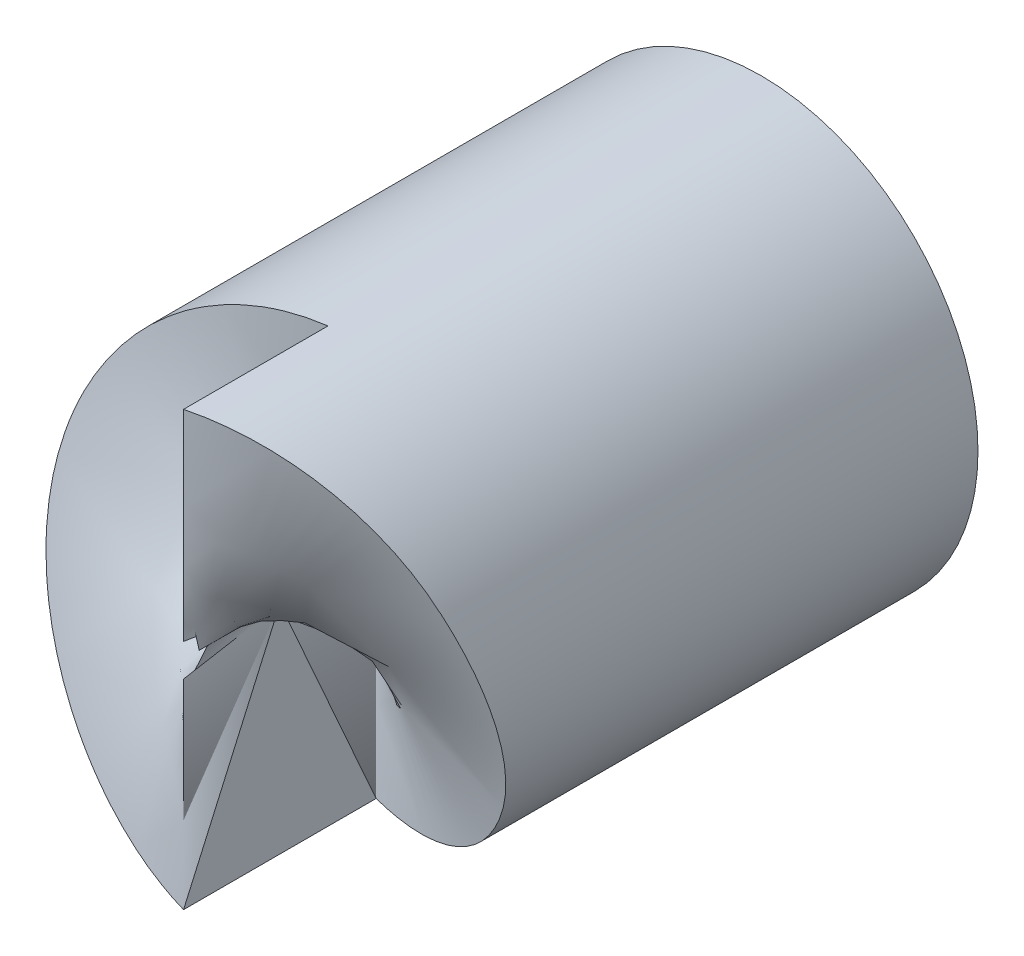
ISO-10303-21;
HEADER;
FILE_DESCRIPTION(('STEP AP214'),'2;1');
FILE_NAME('part.step','',(''),(''),'','','');
FILE_SCHEMA(('AUTOMOTIVE_DESIGN { 1 0 10303 214 1 1 1 1 }'));
ENDSEC;
DATA;
#1=APPLICATION_CONTEXT('core data for automotive mechanical design processes');
#2=APPLICATION_PROTOCOL_DEFINITION('international standard','automotive_design',2000,#1);
#3=PRODUCT_CONTEXT('',#1,'mechanical');
#4=PRODUCT('Part','Part','',(#3));
#5=PRODUCT_RELATED_PRODUCT_CATEGORY('part','',(#4));
#6=PRODUCT_DEFINITION_FORMATION('','',#4);
#7=PRODUCT_DEFINITION_CONTEXT('part definition',#1,'design');
#8=PRODUCT_DEFINITION('design','',#6,#7);
#9=PRODUCT_DEFINITION_SHAPE('','',#8);
#10=(LENGTH_UNIT() NAMED_UNIT(*) SI_UNIT(.MILLI.,.METRE.));
#11=(NAMED_UNIT(*) PLANE_ANGLE_UNIT() SI_UNIT($,.RADIAN.));
#12=(NAMED_UNIT(*) SI_UNIT($,.STERADIAN.) SOLID_ANGLE_UNIT());
#13=UNCERTAINTY_MEASURE_WITH_UNIT(LENGTH_MEASURE(1.E-05),#10,'distance_accuracy_value','');
#14=(GEOMETRIC_REPRESENTATION_CONTEXT(3) GLOBAL_UNCERTAINTY_ASSIGNED_CONTEXT((#13)) GLOBAL_UNIT_ASSIGNED_CONTEXT((#10,
#11,#12)) REPRESENTATION_CONTEXT('',''));
#15=CARTESIAN_POINT('',(0.,0.,0.));
#16=DIRECTION('',(0.,0.,1.));
#17=DIRECTION('',(1.,0.,0.));
#18=AXIS2_PLACEMENT_3D('',#15,#16,#17);
#19=CARTESIAN_POINT('',(0.,0.,6.));
#20=DIRECTION('',(0.,0.,-1.));
#21=DIRECTION('',(-1.,0.,0.));
#22=AXIS2_PLACEMENT_3D('',#19,#20,#21);
#23=CYLINDRICAL_SURFACE('',#22,2.25);
#24=CARTESIAN_POINT('',(0.,0.,0.));
#25=DIRECTION('',(0.,0.,1.));
#26=DIRECTION('',(1.,0.,0.));
#27=AXIS2_PLACEMENT_3D('',#24,#25,#26);
#28=CIRCLE('',#27,2.25);
#29=CARTESIAN_POINT('',(2.25,0.,0.));
#30=VERTEX_POINT('',#29);
#31=EDGE_CURVE('E89',#30,#30,#28,.T.);
#32=ORIENTED_EDGE('',*,*,#31,.T.);
#33=EDGE_LOOP('',(#32));
#34=FACE_BOUND('',#33,.T.);
#35=CARTESIAN_POINT('',(0.,2.25,6.));
#36=CARTESIAN_POINT('',(1.29903810567666,2.25,5.66666666666667));
#37=CARTESIAN_POINT('',(1.94855715851499,1.125,5.33333333333334));
#38=CARTESIAN_POINT('',(2.59807621135332,0.,5.));
#39=CARTESIAN_POINT('',(1.94855715851499,-1.125,4.66666666666667));
#40=CARTESIAN_POINT('',(1.29903810567666,-2.25,4.33333333333334));
#41=CARTESIAN_POINT('',(0.,-2.25,4.00000000000001));
#42=CARTESIAN_POINT('',(-1.29903810567666,-2.25,3.66666666666668));
#43=CARTESIAN_POINT('',(-1.94855715851499,-1.125,3.33333333333335));
#44=(BOUNDED_CURVE() B_SPLINE_CURVE(2,(#35,#36,#37,#38,#39,#40,#41,#42,#43),.UNSPECIFIED.,.F.,
.F.) B_SPLINE_CURVE_WITH_KNOTS((3,2,2,2,3),(0.,0.25,0.5,0.75,1.),
.UNSPECIFIED.) CURVE() GEOMETRIC_REPRESENTATION_ITEM() RATIONAL_B_SPLINE_CURVE((1.,
0.866025403784439,1.,0.866025403784439,1.,0.866025403784439,1.,0.866025403784439,1.)) REPRESENTATION_ITEM(''));
#45=CARTESIAN_POINT('',(0.,-2.25,4.));
#46=VERTEX_POINT('',#45);
#47=CARTESIAN_POINT('',(0.,2.25,6.));
#48=VERTEX_POINT('',#47);
#49=EDGE_CURVE('E65',#46,#48,#44,.F.);
#50=ORIENTED_EDGE('',*,*,#49,.F.);
#51=DIRECTION('',(0.,0.,-1.));
#52=VECTOR('',#51,1.);
#53=CARTESIAN_POINT('',(0.,-2.25,6.));
#54=LINE('',#53,#52);
#55=CARTESIAN_POINT('',(0.,-2.25,6.));
#56=VERTEX_POINT('',#55);
#57=EDGE_CURVE('E72',#56,#46,#54,.T.);
#58=ORIENTED_EDGE('',*,*,#57,.F.);
#59=CARTESIAN_POINT('',(0.,2.25,4.5));
#60=CARTESIAN_POINT('',(-0.0640896624234193,2.24999980677195,4.50903017786127));
#61=CARTESIAN_POINT('',(-0.128126333325893,2.24726004981618,4.51821052736902));
#62=CARTESIAN_POINT('',(-0.255686231933296,2.23634206390557,4.53686457935782));
#63=CARTESIAN_POINT('',(-0.319209499158469,2.22816425766957,4.5463382589827));
#64=CARTESIAN_POINT('',(-0.508190098915773,2.19557255031229,4.57515694713224));
#65=CARTESIAN_POINT('',(-0.632287642858282,2.16310004020579,4.59493157512761));
#66=CARTESIAN_POINT('',(-0.873029845838225,2.07765688194301,4.63539195623004));
#67=CARTESIAN_POINT('',(-0.9896720553196,2.02467953656102,4.65607800506433));
#68=CARTESIAN_POINT('',(-1.21219078033755,1.89983317890576,4.69819713224773));
#69=CARTESIAN_POINT('',(-1.31806882824197,1.82796686087185,4.71963010368123));
#70=CARTESIAN_POINT('',(-1.51650208438443,1.66705929939474,4.76334254984294));
#71=CARTESIAN_POINT('',(-1.60899937417787,1.57794707842578,4.7856252062531));
#72=CARTESIAN_POINT('',(-1.73526578272611,1.43368621535243,4.81974578991957));
#73=CARTESIAN_POINT('',(-1.77529210301425,1.383805343587,4.83124153349972));
#74=CARTESIAN_POINT('',(-1.85093190126854,1.28087089768735,4.85454296163525));
#75=CARTESIAN_POINT('',(-1.88654537183807,1.2278173182354,4.86634864671012));
#76=CARTESIAN_POINT('',(-1.98662682368489,1.06404623831804,4.90232151037629));
#77=CARTESIAN_POINT('',(-2.04406575893717,0.949027674365439,4.92697269507453));
#78=CARTESIAN_POINT('',(-2.1384966183688,0.711144593697612,4.97719241147487));
#79=CARTESIAN_POINT('',(-2.17548888670275,0.588280209080657,5.00276092772891));
#80=CARTESIAN_POINT('',(-2.22826591187998,0.337432656168469,5.05486878483683));
#81=CARTESIAN_POINT('',(-2.24391540220964,0.209422084571818,5.08141323278463));
#82=CARTESIAN_POINT('',(-2.25316254529583,-0.047280374951385,5.13533657251712));
#83=CARTESIAN_POINT('',(-2.24675957368821,-0.175972282065366,5.16271548790606));
#84=CARTESIAN_POINT('',(-2.22082806979252,-0.366875526251029,5.20458435907347));
#85=CARTESIAN_POINT('',(-2.2093977243273,-0.430361096553371,5.21872229086635));
#86=CARTESIAN_POINT('',(-2.18115813540892,-0.55605628093917,5.24729574376554));
#87=CARTESIAN_POINT('',(-2.16434886869974,-0.618265889504703,5.26173126615824));
#88=CARTESIAN_POINT('',(-2.10603113969286,-0.802282672039853,5.3054345276847));
#89=CARTESIAN_POINT('',(-2.05661793922341,-0.92158559630382,5.33512230399567));
#90=CARTESIAN_POINT('',(-1.93793543625847,-1.15050133278164,5.39553708394608));
#91=CARTESIAN_POINT('',(-1.86854365410466,-1.26004874176529,5.42626943380935));
#92=CARTESIAN_POINT('',(-1.7121551488703,-1.4654963572101,5.48855974060056));
#93=CARTESIAN_POINT('',(-1.62515958384204,-1.56139746067729,5.52011764310127));
#94=CARTESIAN_POINT('',(-1.43558520804414,-1.73736627508257,5.58443976107189));
#95=CARTESIAN_POINT('',(-1.332901875711,-1.8173188097862,5.6172108585047));
#96=CARTESIAN_POINT('',(-1.1155148991094,-1.95829442566134,5.68385080625046));
#97=CARTESIAN_POINT('',(-1.0008051870504,-2.01930788922841,5.71772020469026));
#98=CARTESIAN_POINT('',(-0.761913081560492,-2.12108164464317,5.78656514694209));
#99=CARTESIAN_POINT('',(-0.637663212106608,-2.16167867986365,5.82154730065309));
#100=CARTESIAN_POINT('',(-0.384446950858654,-2.22070549137662,5.89234003932458));
#101=CARTESIAN_POINT('',(-0.255490703482943,-2.23918034366112,5.92814878765598));
#102=CARTESIAN_POINT('',(-0.0841404099110047,-2.24882549932849,5.97624086637611));
#103=CARTESIAN_POINT('',(-0.0420515056018201,-2.25000819863371,5.98809446466825));
#104=CARTESIAN_POINT('',(0.,-2.25,6.));
#105=B_SPLINE_CURVE_WITH_KNOTS('',3,(#59,#60,#61,#62,#63,#64,#65,#66,#67,#68,#69,#70,#71,#72,
#73,#74,#75,#76,#77,#78,#79,#80,#81,#82,#83,#84,#85,#86,#87,#88,#89,#90,#91,#92,#93,#94,#95,#96,
#97,#98,#99,#100,#101,#102,#103,#104),.UNSPECIFIED.,.F.,.F.,(4,2,2,2,2,2,2,2,2,2,2,2,2,2,2,2,2,
2,2,2,2,2,4),(0.,0.194047766393508,0.388080450529262,0.775459809585888,1.16296580020267,
1.55041654864864,1.93949717532641,2.13423869593956,2.3289805429655,2.71969896148904,
3.11041080331056,3.50358757227993,3.89677547322644,4.09468635484247,4.29259809214781,
4.68809192773764,5.08606395692507,5.48400981431277,5.88473302822438,6.28565940500663,
6.68974268223925,7.09300119371439,7.22415728271685),.UNSPECIFIED.);
#106=CARTESIAN_POINT('',(0.,2.25,4.5));
#107=VERTEX_POINT('',#106);
#108=EDGE_CURVE('E77',#107,#56,#105,.T.);
#109=ORIENTED_EDGE('',*,*,#108,.F.);
#110=DIRECTION('',(0.,0.,-1.));
#111=VECTOR('',#110,1.);
#112=CARTESIAN_POINT('',(0.,2.25,6.));
#113=LINE('',#112,#111);
#114=EDGE_CURVE('E49',#107,#48,#113,.F.);
#115=ORIENTED_EDGE('',*,*,#114,.T.);
#116=EDGE_LOOP('',(#50,#58,#109,#115));
#117=FACE_BOUND('',#116,.T.);
#118=ADVANCED_FACE('F33',(#34,#117),#23,.T.);
#119=CARTESIAN_POINT('',(0.,0.,0.));
#120=DIRECTION('',(0.,0.,1.));
#121=DIRECTION('',(1.,0.,0.));
#122=AXIS2_PLACEMENT_3D('',#119,#120,#121);
#123=PLANE('',#122);
#124=CARTESIAN_POINT('',(0.,0.,0.));
#125=DIRECTION('',(0.,0.,-1.));
#126=DIRECTION('',(-1.,0.,0.));
#127=AXIS2_PLACEMENT_3D('',#124,#125,#126);
#128=CIRCLE('',#127,1.575);
#129=CARTESIAN_POINT('',(-1.575,0.,0.));
#130=VERTEX_POINT('',#129);
#131=EDGE_CURVE('E78',#130,#130,#128,.T.);
#132=ORIENTED_EDGE('',*,*,#131,.F.);
#133=EDGE_LOOP('',(#132));
#134=FACE_BOUND('',#133,.T.);
#135=ORIENTED_EDGE('',*,*,#31,.F.);
#136=EDGE_LOOP('',(#135));
#137=FACE_BOUND('',#136,.T.);
#138=ADVANCED_FACE('F122',(#134,#137),#123,.F.);
#139=CARTESIAN_POINT('',(0.,0.,3.));
#140=DIRECTION('',(0.,0.,-1.));
#141=DIRECTION('',(-1.,0.,0.));
#142=AXIS2_PLACEMENT_3D('',#139,#140,#141);
#143=CYLINDRICAL_SURFACE('',#142,1.575);
#144=CARTESIAN_POINT('',(0.,0.,3.));
#145=DIRECTION('',(0.,0.,-1.));
#146=DIRECTION('',(-1.,0.,0.));
#147=AXIS2_PLACEMENT_3D('',#144,#145,#146);
#148=CIRCLE('',#147,1.575);
#149=CARTESIAN_POINT('',(-1.575,0.,3.));
#150=VERTEX_POINT('',#149);
#151=EDGE_CURVE('E80',#150,#150,#148,.T.);
#152=ORIENTED_EDGE('',*,*,#151,.F.);
#153=EDGE_LOOP('',(#152));
#154=FACE_BOUND('',#153,.T.);
#155=ORIENTED_EDGE('',*,*,#131,.T.);
#156=EDGE_LOOP('',(#155));
#157=FACE_BOUND('',#156,.T.);
#158=ADVANCED_FACE('F119',(#154,#157),#143,.F.);
#159=CARTESIAN_POINT('',(0.,0.,3.));
#160=DIRECTION('',(0.,0.,-1.));
#161=DIRECTION('',(-1.,0.,0.));
#162=AXIS2_PLACEMENT_3D('',#159,#160,#161);
#163=PLANE('',#162);
#164=ORIENTED_EDGE('',*,*,#151,.T.);
#165=EDGE_LOOP('',(#164));
#166=FACE_BOUND('',#165,.T.);
#167=ADVANCED_FACE('F116',(#166),#163,.T.);
#168=CARTESIAN_POINT('',(0.,0.,-1.5));
#169=DIRECTION('',(1.,0.,0.));
#170=DIRECTION('',(0.,0.,1.));
#171=AXIS2_PLACEMENT_3D('',#168,#169,#170);
#172=PLANE('',#171);
#173=DIRECTION('',(0.,-1.,0.));
#174=VECTOR('',#173,1.);
#175=CARTESIAN_POINT('',(0.,0.,4.5));
#176=LINE('',#175,#174);
#177=CARTESIAN_POINT('',(0.,0.,5.00011499999375));
#178=VERTEX_POINT('',#177);
#179=EDGE_CURVE('E71',#107,#178,#176,.T.);
#180=ORIENTED_EDGE('',*,*,#179,.T.);
#181=DIRECTION('',(0.,1.,0.));
#182=VECTOR('',#181,1.);
#183=CARTESIAN_POINT('',(0.,0.,6.));
#184=LINE('',#183,#182);
#185=EDGE_CURVE('E11',#178,#48,#184,.T.);
#186=ORIENTED_EDGE('',*,*,#185,.T.);
#187=ORIENTED_EDGE('',*,*,#114,.F.);
#188=EDGE_LOOP('',(#180,#186,#187));
#189=FACE_BOUND('',#188,.T.);
#190=ADVANCED_FACE('F74',(#189),#172,.F.);
#191=CARTESIAN_POINT('',(0.,-3.02262589759933,6.));
#192=CARTESIAN_POINT('',(-0.591913820782573,-3.02262590349126,5.87533222854843));
#193=CARTESIAN_POINT('',(-1.21923748128518,-2.84310453068848,5.75000000000008));
#194=CARTESIAN_POINT('',(-2.29129119234119,-2.07840516644711,5.49999999999992));
#195=CARTESIAN_POINT('',(-2.73566129106132,-1.48862202610476,5.37500000000021));
#196=CARTESIAN_POINT('',(-3.11425158973553,-0.0357101405963287,5.12499999999979));
#197=CARTESIAN_POINT('',(-3.04053475166739,0.834575973095926,4.99999999999953));
#198=CARTESIAN_POINT('',(-2.09269492086197,2.35838854227481,4.75000000000047));
#199=CARTESIAN_POINT('',(-1.20553965014127,3.02262587313033,4.6269542431482));
#200=CARTESIAN_POINT('',(0.,3.02262589759933,4.5));
#201=CARTESIAN_POINT('',(0.,0.,6.));
#202=CARTESIAN_POINT('',(0.,0.,5.87499999999994));
#203=CARTESIAN_POINT('',(0.,0.,5.75000000000008));
#204=CARTESIAN_POINT('',(0.,0.,5.49999999999992));
#205=CARTESIAN_POINT('',(0.,0.,5.37500000000021));
#206=CARTESIAN_POINT('',(0.,0.,5.12499999999979));
#207=CARTESIAN_POINT('',(0.,0.,4.99999999999953));
#208=CARTESIAN_POINT('',(0.,0.,4.75000000000047));
#209=CARTESIAN_POINT('',(0.,0.,4.62499999999965));
#210=CARTESIAN_POINT('',(0.,0.,4.5));
#211=B_SPLINE_SURFACE_WITH_KNOTS('',1,3,((#191,#192,#193,#194,#195,#196,#197,#198,#199,#200),
(#201,#202,#203,#204,#205,#206,#207,#208,#209,#210)),.UNSPECIFIED.,.F.,.F.,.F.,(2,2),(4,2,2,2,
4),(0.,1.),(0.,0.25,0.5,0.75,1.),.UNSPECIFIED.);
#212=DIRECTION('',(0.,1.,0.));
#213=VECTOR('',#212,1.);
#214=CARTESIAN_POINT('',(0.,-1.51131294879966,6.));
#215=LINE('',#214,#213);
#216=EDGE_CURVE('E43',#178,#56,#215,.F.);
#217=ORIENTED_EDGE('',*,*,#108,.T.);
#218=ORIENTED_EDGE('',*,*,#216,.F.);
#219=ORIENTED_EDGE('',*,*,#179,.F.);
#220=EDGE_LOOP('',(#217,#218,#219));
#221=FACE_BOUND('',#220,.T.);
#222=ADVANCED_FACE('F99',(#221),#211,.T.);
#223=CARTESIAN_POINT('',(0.,0.,-2.));
#224=DIRECTION('',(1.,0.,0.));
#225=DIRECTION('',(0.,0.,1.));
#226=AXIS2_PLACEMENT_3D('',#223,#224,#225);
#227=PLANE('',#226);
#228=ORIENTED_EDGE('',*,*,#57,.T.);
#229=DIRECTION('',(0.,-1.,0.));
#230=VECTOR('',#229,1.);
#231=CARTESIAN_POINT('',(0.,-3.16632916616858,4.));
#232=LINE('',#231,#230);
#233=EDGE_CURVE('E68',#178,#46,#232,.T.);
#234=ORIENTED_EDGE('',*,*,#233,.F.);
#235=ORIENTED_EDGE('',*,*,#216,.T.);
#236=EDGE_LOOP('',(#228,#234,#235));
#237=FACE_BOUND('',#236,.T.);
#238=ADVANCED_FACE('F106',(#237),#227,.T.);
#239=CARTESIAN_POINT('',(0.,-2.25,6.));
#240=CARTESIAN_POINT('',(-1.29903810567666,-2.25,5.66666666666667));
#241=CARTESIAN_POINT('',(-1.94855715851499,-1.125,5.33333333333334));
#242=CARTESIAN_POINT('',(-2.59807621135332,0.,5.));
#243=CARTESIAN_POINT('',(-1.94855715851499,1.125,4.66666666666667));
#244=CARTESIAN_POINT('',(-1.29903810567666,2.25,4.33333333333334));
#245=CARTESIAN_POINT('',(0.,2.25,4.00000000000001));
#246=CARTESIAN_POINT('',(1.29903810567666,2.25,3.66666666666668));
#247=CARTESIAN_POINT('',(1.94855715851499,1.125,3.33333333333335));
#248=CARTESIAN_POINT('',(0.,0.,6.));
#249=CARTESIAN_POINT('',(0.,0.,5.66666666666667));
#250=CARTESIAN_POINT('',(0.,0.,5.33333333333334));
#251=CARTESIAN_POINT('',(0.,0.,5.));
#252=CARTESIAN_POINT('',(0.,0.,4.66666666666667));
#253=CARTESIAN_POINT('',(0.,0.,4.33333333333334));
#254=CARTESIAN_POINT('',(0.,0.,4.00000000000001));
#255=CARTESIAN_POINT('',(0.,0.,3.66666666666668));
#256=CARTESIAN_POINT('',(0.,0.,3.33333333333335));
#257=CARTESIAN_POINT('',(0.,3.16632916616858,6.));
#258=CARTESIAN_POINT('',(1.8280809964304,3.16632916616858,5.66666666666667));
#259=CARTESIAN_POINT('',(2.74212149464559,1.58316458308429,5.33333333333334));
#260=CARTESIAN_POINT('',(3.65616199286079,0.,5.));
#261=CARTESIAN_POINT('',(2.74212149464559,-1.58316458308429,4.66666666666667));
#262=CARTESIAN_POINT('',(1.8280809964304,-3.16632916616858,4.33333333333334));
#263=CARTESIAN_POINT('',(0.,-3.16632916616858,4.00000000000001));
#264=CARTESIAN_POINT('',(-1.82808099643039,-3.16632916616859,3.66666666666668));
#265=CARTESIAN_POINT('',(-2.74212149464559,-1.58316458308429,3.33333333333335));
#266=(BOUNDED_SURFACE() B_SPLINE_SURFACE(1,2,((#239,#240,#241,#242,#243,#244,#245,#246,#247),
(#248,#249,#250,#251,#252,#253,#254,#255,#256),(#257,#258,#259,#260,#261,#262,#263,#264,#265)),
.UNSPECIFIED.,.F.,.F.,.F.) B_SPLINE_SURFACE_WITH_KNOTS((2,1,2),(3,2,2,2,3),(-0.71060205111985,
0.,1.),(0.,0.25,0.5,0.75,1.),
.UNSPECIFIED.) GEOMETRIC_REPRESENTATION_ITEM() RATIONAL_B_SPLINE_SURFACE(((1.,0.866025403784439,
1.,0.866025403784439,1.,0.866025403784439,1.,0.866025403784439,1.),(1.,0.866025403784439,1.,
0.866025403784439,1.,0.866025403784439,1.,0.866025403784439,1.),(1.,0.866025403784439,1.,
0.866025403784439,1.,0.866025403784439,1.,0.866025403784439,1.))) REPRESENTATION_ITEM('') SURFACE());
#267=ORIENTED_EDGE('',*,*,#49,.T.);
#268=ORIENTED_EDGE('',*,*,#185,.F.);
#269=ORIENTED_EDGE('',*,*,#233,.T.);
#270=EDGE_LOOP('',(#267,#268,#269));
#271=FACE_BOUND('',#270,.T.);
#272=ADVANCED_FACE('F66',(#271),#266,.F.);
#273=CLOSED_SHELL('',(#118,#138,#158,#167,#190,#222,#238,#272));
#274=MANIFOLD_SOLID_BREP('B2',#273);
#275=ADVANCED_BREP_SHAPE_REPRESENTATION('',(#18,#274),#14);
#276=SHAPE_DEFINITION_REPRESENTATION(#9,#275);
ENDSEC;
END-ISO-10303-21;
